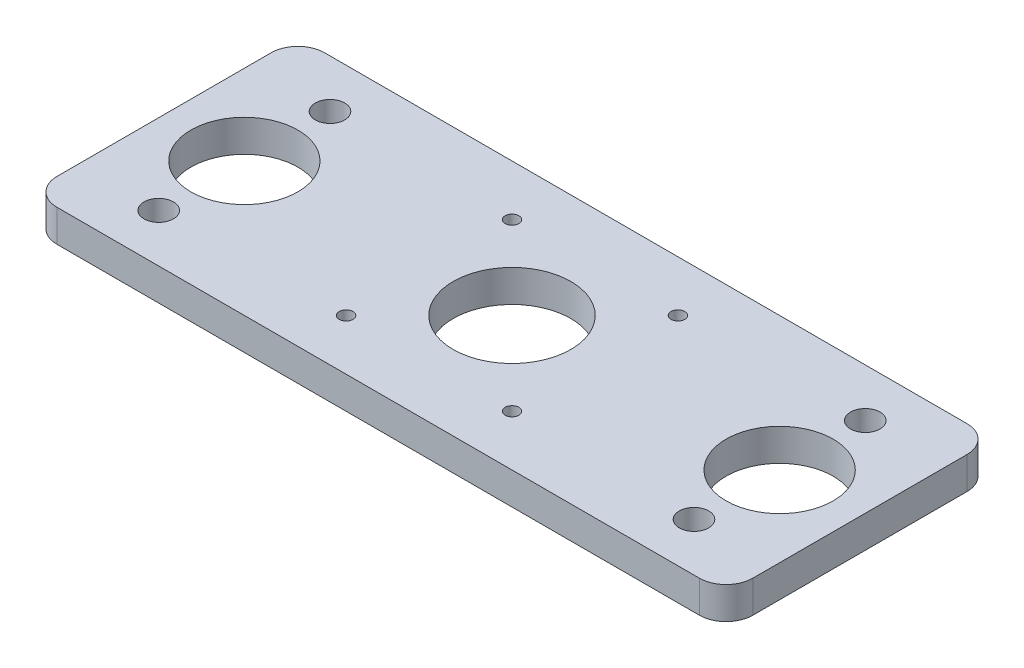
ISO-10303-21;
HEADER;
FILE_DESCRIPTION(('STEP AP214'),'2;1');
FILE_NAME('part.step','',(''),(''),'','','');
FILE_SCHEMA(('AUTOMOTIVE_DESIGN { 1 0 10303 214 1 1 1 1 }'));
ENDSEC;
DATA;
#1=APPLICATION_CONTEXT('core data for automotive mechanical design processes');
#2=APPLICATION_PROTOCOL_DEFINITION('international standard','automotive_design',2000,#1);
#3=PRODUCT_CONTEXT('',#1,'mechanical');
#4=PRODUCT('Part','Part','',(#3));
#5=PRODUCT_RELATED_PRODUCT_CATEGORY('part','',(#4));
#6=PRODUCT_DEFINITION_FORMATION('','',#4);
#7=PRODUCT_DEFINITION_CONTEXT('part definition',#1,'design');
#8=PRODUCT_DEFINITION('design','',#6,#7);
#9=PRODUCT_DEFINITION_SHAPE('','',#8);
#10=(LENGTH_UNIT() NAMED_UNIT(*) SI_UNIT(.MILLI.,.METRE.));
#11=(NAMED_UNIT(*) PLANE_ANGLE_UNIT() SI_UNIT($,.RADIAN.));
#12=(NAMED_UNIT(*) SI_UNIT($,.STERADIAN.) SOLID_ANGLE_UNIT());
#13=UNCERTAINTY_MEASURE_WITH_UNIT(LENGTH_MEASURE(1.E-05),#10,'distance_accuracy_value','');
#14=(GEOMETRIC_REPRESENTATION_CONTEXT(3) GLOBAL_UNCERTAINTY_ASSIGNED_CONTEXT((#13)) GLOBAL_UNIT_ASSIGNED_CONTEXT((#10,
#11,#12)) REPRESENTATION_CONTEXT('',''));
#15=CARTESIAN_POINT('',(0.,0.,0.));
#16=DIRECTION('',(0.,0.,1.));
#17=DIRECTION('',(1.,0.,0.));
#18=AXIS2_PLACEMENT_3D('',#15,#16,#17);
#19=CARTESIAN_POINT('',(-60.,6.,-20.));
#20=DIRECTION('',(0.,-1.,0.));
#21=DIRECTION('',(0.,0.,-1.));
#22=AXIS2_PLACEMENT_3D('',#19,#20,#21);
#23=CYLINDRICAL_SURFACE('',#22,5.);
#24=CARTESIAN_POINT('',(-60.,0.,-20.));
#25=DIRECTION('',(0.,1.,0.));
#26=DIRECTION('',(0.,0.,1.));
#27=AXIS2_PLACEMENT_3D('',#24,#25,#26);
#28=CIRCLE('',#27,5.);
#29=CARTESIAN_POINT('',(-65.,0.,-20.));
#30=VERTEX_POINT('',#29);
#31=CARTESIAN_POINT('',(-60.,0.,-25.));
#32=VERTEX_POINT('',#31);
#33=EDGE_CURVE('E166',#30,#32,#28,.F.);
#34=ORIENTED_EDGE('',*,*,#33,.F.);
#35=DIRECTION('',(0.,-1.,0.));
#36=VECTOR('',#35,1.);
#37=CARTESIAN_POINT('',(-65.,6.,-20.));
#38=LINE('',#37,#36);
#39=CARTESIAN_POINT('',(-65.,6.,-20.));
#40=VERTEX_POINT('',#39);
#41=EDGE_CURVE('E11',#40,#30,#38,.T.);
#42=ORIENTED_EDGE('',*,*,#41,.F.);
#43=CARTESIAN_POINT('',(-60.,6.,-20.));
#44=DIRECTION('',(0.,1.,0.));
#45=DIRECTION('',(0.,0.,1.));
#46=AXIS2_PLACEMENT_3D('',#43,#44,#45);
#47=CIRCLE('',#46,5.);
#48=CARTESIAN_POINT('',(-60.,6.,-25.));
#49=VERTEX_POINT('',#48);
#50=EDGE_CURVE('E219',#40,#49,#47,.F.);
#51=ORIENTED_EDGE('',*,*,#50,.T.);
#52=DIRECTION('',(0.,-1.,0.));
#53=VECTOR('',#52,1.);
#54=CARTESIAN_POINT('',(-60.,6.,-25.));
#55=LINE('',#54,#53);
#56=EDGE_CURVE('E53',#49,#32,#55,.T.);
#57=ORIENTED_EDGE('',*,*,#56,.T.);
#58=EDGE_LOOP('',(#34,#42,#51,#57));
#59=FACE_BOUND('',#58,.T.);
#60=ADVANCED_FACE('F37',(#59),#23,.T.);
#61=CARTESIAN_POINT('',(-65.,6.,0.));
#62=DIRECTION('',(-1.,0.,0.));
#63=DIRECTION('',(0.,0.,1.));
#64=AXIS2_PLACEMENT_3D('',#61,#62,#63);
#65=PLANE('',#64);
#66=DIRECTION('',(0.,0.,-1.));
#67=VECTOR('',#66,1.);
#68=CARTESIAN_POINT('',(-65.,0.,0.));
#69=LINE('',#68,#67);
#70=CARTESIAN_POINT('',(-65.,0.,20.));
#71=VERTEX_POINT('',#70);
#72=EDGE_CURVE('E168',#71,#30,#69,.T.);
#73=ORIENTED_EDGE('',*,*,#72,.F.);
#74=DIRECTION('',(0.,-1.,0.));
#75=VECTOR('',#74,1.);
#76=CARTESIAN_POINT('',(-65.,6.,20.));
#77=LINE('',#76,#75);
#78=CARTESIAN_POINT('',(-65.,6.,20.));
#79=VERTEX_POINT('',#78);
#80=EDGE_CURVE('E45',#79,#71,#77,.T.);
#81=ORIENTED_EDGE('',*,*,#80,.F.);
#82=DIRECTION('',(0.,0.,-1.));
#83=VECTOR('',#82,1.);
#84=CARTESIAN_POINT('',(-65.,6.,0.));
#85=LINE('',#84,#83);
#86=EDGE_CURVE('E245',#79,#40,#85,.T.);
#87=ORIENTED_EDGE('',*,*,#86,.T.);
#88=ORIENTED_EDGE('',*,*,#41,.T.);
#89=EDGE_LOOP('',(#73,#81,#87,#88));
#90=FACE_BOUND('',#89,.T.);
#91=ADVANCED_FACE('F236',(#90),#65,.T.);
#92=CARTESIAN_POINT('',(-60.,6.,20.));
#93=DIRECTION('',(0.,-1.,0.));
#94=DIRECTION('',(0.,0.,-1.));
#95=AXIS2_PLACEMENT_3D('',#92,#93,#94);
#96=CYLINDRICAL_SURFACE('',#95,5.);
#97=CARTESIAN_POINT('',(-60.,0.,20.));
#98=DIRECTION('',(0.,1.,0.));
#99=DIRECTION('',(0.,0.,1.));
#100=AXIS2_PLACEMENT_3D('',#97,#98,#99);
#101=CIRCLE('',#100,5.);
#102=CARTESIAN_POINT('',(-60.,0.,25.));
#103=VERTEX_POINT('',#102);
#104=EDGE_CURVE('E171',#103,#71,#101,.F.);
#105=ORIENTED_EDGE('',*,*,#104,.F.);
#106=DIRECTION('',(0.,-1.,0.));
#107=VECTOR('',#106,1.);
#108=CARTESIAN_POINT('',(-60.,6.,25.));
#109=LINE('',#108,#107);
#110=CARTESIAN_POINT('',(-60.,6.,25.));
#111=VERTEX_POINT('',#110);
#112=EDGE_CURVE('E225',#111,#103,#109,.T.);
#113=ORIENTED_EDGE('',*,*,#112,.F.);
#114=CARTESIAN_POINT('',(-60.,6.,20.));
#115=DIRECTION('',(0.,1.,0.));
#116=DIRECTION('',(0.,0.,1.));
#117=AXIS2_PLACEMENT_3D('',#114,#115,#116);
#118=CIRCLE('',#117,5.);
#119=EDGE_CURVE('E232',#111,#79,#118,.F.);
#120=ORIENTED_EDGE('',*,*,#119,.T.);
#121=ORIENTED_EDGE('',*,*,#80,.T.);
#122=EDGE_LOOP('',(#105,#113,#120,#121));
#123=FACE_BOUND('',#122,.T.);
#124=ADVANCED_FACE('F230',(#123),#96,.T.);
#125=CARTESIAN_POINT('',(0.,6.,25.));
#126=DIRECTION('',(0.,0.,1.));
#127=DIRECTION('',(1.,0.,0.));
#128=AXIS2_PLACEMENT_3D('',#125,#126,#127);
#129=PLANE('',#128);
#130=DIRECTION('',(-1.,0.,0.));
#131=VECTOR('',#130,1.);
#132=CARTESIAN_POINT('',(0.,0.,25.));
#133=LINE('',#132,#131);
#134=CARTESIAN_POINT('',(60.,0.,25.));
#135=VERTEX_POINT('',#134);
#136=EDGE_CURVE('E174',#135,#103,#133,.T.);
#137=ORIENTED_EDGE('',*,*,#136,.F.);
#138=DIRECTION('',(0.,-1.,0.));
#139=VECTOR('',#138,1.);
#140=CARTESIAN_POINT('',(60.,6.,25.));
#141=LINE('',#140,#139);
#142=CARTESIAN_POINT('',(60.,6.,25.));
#143=VERTEX_POINT('',#142);
#144=EDGE_CURVE('E223',#143,#135,#141,.T.);
#145=ORIENTED_EDGE('',*,*,#144,.F.);
#146=DIRECTION('',(-1.,0.,0.));
#147=VECTOR('',#146,1.);
#148=CARTESIAN_POINT('',(0.,6.,25.));
#149=LINE('',#148,#147);
#150=EDGE_CURVE('E128',#143,#111,#149,.T.);
#151=ORIENTED_EDGE('',*,*,#150,.T.);
#152=ORIENTED_EDGE('',*,*,#112,.T.);
#153=EDGE_LOOP('',(#137,#145,#151,#152));
#154=FACE_BOUND('',#153,.T.);
#155=ADVANCED_FACE('F243',(#154),#129,.T.);
#156=CARTESIAN_POINT('',(60.,6.,20.));
#157=DIRECTION('',(0.,-1.,0.));
#158=DIRECTION('',(0.,0.,-1.));
#159=AXIS2_PLACEMENT_3D('',#156,#157,#158);
#160=CYLINDRICAL_SURFACE('',#159,5.);
#161=CARTESIAN_POINT('',(60.,0.,20.));
#162=DIRECTION('',(0.,1.,0.));
#163=DIRECTION('',(0.,0.,1.));
#164=AXIS2_PLACEMENT_3D('',#161,#162,#163);
#165=CIRCLE('',#164,5.);
#166=CARTESIAN_POINT('',(65.,0.,20.));
#167=VERTEX_POINT('',#166);
#168=EDGE_CURVE('E177',#135,#167,#165,.T.);
#169=ORIENTED_EDGE('',*,*,#168,.T.);
#170=DIRECTION('',(0.,-1.,0.));
#171=VECTOR('',#170,1.);
#172=CARTESIAN_POINT('',(65.,6.,20.));
#173=LINE('',#172,#171);
#174=CARTESIAN_POINT('',(65.,6.,20.));
#175=VERTEX_POINT('',#174);
#176=EDGE_CURVE('E113',#175,#167,#173,.T.);
#177=ORIENTED_EDGE('',*,*,#176,.F.);
#178=CARTESIAN_POINT('',(60.,6.,20.));
#179=DIRECTION('',(0.,1.,0.));
#180=DIRECTION('',(0.,0.,1.));
#181=AXIS2_PLACEMENT_3D('',#178,#179,#180);
#182=CIRCLE('',#181,5.);
#183=EDGE_CURVE('E125',#143,#175,#182,.T.);
#184=ORIENTED_EDGE('',*,*,#183,.F.);
#185=ORIENTED_EDGE('',*,*,#144,.T.);
#186=EDGE_LOOP('',(#169,#177,#184,#185));
#187=FACE_BOUND('',#186,.T.);
#188=ADVANCED_FACE('F275',(#187),#160,.T.);
#189=CARTESIAN_POINT('',(65.,6.,0.));
#190=DIRECTION('',(1.,0.,0.));
#191=DIRECTION('',(0.,0.,-1.));
#192=AXIS2_PLACEMENT_3D('',#189,#190,#191);
#193=PLANE('',#192);
#194=DIRECTION('',(0.,0.,1.));
#195=VECTOR('',#194,1.);
#196=CARTESIAN_POINT('',(65.,0.,0.));
#197=LINE('',#196,#195);
#198=CARTESIAN_POINT('',(65.,0.,-20.));
#199=VERTEX_POINT('',#198);
#200=EDGE_CURVE('E110',#199,#167,#197,.T.);
#201=ORIENTED_EDGE('',*,*,#200,.F.);
#202=DIRECTION('',(0.,-1.,0.));
#203=VECTOR('',#202,1.);
#204=CARTESIAN_POINT('',(65.,6.,-20.));
#205=LINE('',#204,#203);
#206=CARTESIAN_POINT('',(65.,6.,-20.));
#207=VERTEX_POINT('',#206);
#208=EDGE_CURVE('E104',#207,#199,#205,.T.);
#209=ORIENTED_EDGE('',*,*,#208,.F.);
#210=DIRECTION('',(0.,0.,1.));
#211=VECTOR('',#210,1.);
#212=CARTESIAN_POINT('',(65.,6.,0.));
#213=LINE('',#212,#211);
#214=EDGE_CURVE('E108',#207,#175,#213,.T.);
#215=ORIENTED_EDGE('',*,*,#214,.T.);
#216=ORIENTED_EDGE('',*,*,#176,.T.);
#217=EDGE_LOOP('',(#201,#209,#215,#216));
#218=FACE_BOUND('',#217,.T.);
#219=ADVANCED_FACE('F106',(#218),#193,.T.);
#220=CARTESIAN_POINT('',(60.,6.,-20.));
#221=DIRECTION('',(0.,-1.,0.));
#222=DIRECTION('',(0.,0.,-1.));
#223=AXIS2_PLACEMENT_3D('',#220,#221,#222);
#224=CYLINDRICAL_SURFACE('',#223,5.);
#225=CARTESIAN_POINT('',(60.,0.,-20.));
#226=DIRECTION('',(0.,1.,0.));
#227=DIRECTION('',(0.,0.,1.));
#228=AXIS2_PLACEMENT_3D('',#225,#226,#227);
#229=CIRCLE('',#228,5.);
#230=CARTESIAN_POINT('',(60.,0.,-25.));
#231=VERTEX_POINT('',#230);
#232=EDGE_CURVE('E181',#199,#231,#229,.T.);
#233=ORIENTED_EDGE('',*,*,#232,.T.);
#234=DIRECTION('',(0.,-1.,0.));
#235=VECTOR('',#234,1.);
#236=CARTESIAN_POINT('',(60.,6.,-25.));
#237=LINE('',#236,#235);
#238=CARTESIAN_POINT('',(60.,6.,-25.));
#239=VERTEX_POINT('',#238);
#240=EDGE_CURVE('E79',#239,#231,#237,.T.);
#241=ORIENTED_EDGE('',*,*,#240,.F.);
#242=CARTESIAN_POINT('',(60.,6.,-20.));
#243=DIRECTION('',(0.,1.,0.));
#244=DIRECTION('',(0.,0.,1.));
#245=AXIS2_PLACEMENT_3D('',#242,#243,#244);
#246=CIRCLE('',#245,5.);
#247=EDGE_CURVE('E115',#207,#239,#246,.T.);
#248=ORIENTED_EDGE('',*,*,#247,.F.);
#249=ORIENTED_EDGE('',*,*,#208,.T.);
#250=EDGE_LOOP('',(#233,#241,#248,#249));
#251=FACE_BOUND('',#250,.T.);
#252=ADVANCED_FACE('F116',(#251),#224,.T.);
#253=CARTESIAN_POINT('',(-50.,6.,16.));
#254=DIRECTION('',(0.,-1.,0.));
#255=DIRECTION('',(0.,0.,-1.));
#256=AXIS2_PLACEMENT_3D('',#253,#254,#255);
#257=CYLINDRICAL_SURFACE('',#256,2.74999999999999);
#258=CARTESIAN_POINT('',(-50.,6.,16.));
#259=DIRECTION('',(0.,1.,0.));
#260=DIRECTION('',(0.,0.,1.));
#261=AXIS2_PLACEMENT_3D('',#258,#259,#260);
#262=CIRCLE('',#261,2.74999999999999);
#263=CARTESIAN_POINT('',(-50.,6.,18.75));
#264=VERTEX_POINT('',#263);
#265=EDGE_CURVE('E160',#264,#264,#262,.F.);
#266=ORIENTED_EDGE('',*,*,#265,.F.);
#267=EDGE_LOOP('',(#266));
#268=FACE_BOUND('',#267,.T.);
#269=CARTESIAN_POINT('',(-50.,0.,16.));
#270=DIRECTION('',(0.,1.,0.));
#271=DIRECTION('',(0.,0.,1.));
#272=AXIS2_PLACEMENT_3D('',#269,#270,#271);
#273=CIRCLE('',#272,2.74999999999999);
#274=CARTESIAN_POINT('',(-50.,0.,18.75));
#275=VERTEX_POINT('',#274);
#276=EDGE_CURVE('E213',#275,#275,#273,.F.);
#277=ORIENTED_EDGE('',*,*,#276,.T.);
#278=EDGE_LOOP('',(#277));
#279=FACE_BOUND('',#278,.T.);
#280=ADVANCED_FACE('F281',(#268,#279),#257,.F.);
#281=CARTESIAN_POINT('',(50.,6.,16.));
#282=DIRECTION('',(0.,-1.,0.));
#283=DIRECTION('',(0.,0.,-1.));
#284=AXIS2_PLACEMENT_3D('',#281,#282,#283);
#285=CYLINDRICAL_SURFACE('',#284,2.74999999999999);
#286=CARTESIAN_POINT('',(50.,6.,16.));
#287=DIRECTION('',(0.,1.,0.));
#288=DIRECTION('',(0.,0.,1.));
#289=AXIS2_PLACEMENT_3D('',#286,#287,#288);
#290=CIRCLE('',#289,2.74999999999999);
#291=CARTESIAN_POINT('',(50.,6.,18.75));
#292=VERTEX_POINT('',#291);
#293=EDGE_CURVE('E157',#292,#292,#290,.T.);
#294=ORIENTED_EDGE('',*,*,#293,.T.);
#295=EDGE_LOOP('',(#294));
#296=FACE_BOUND('',#295,.T.);
#297=CARTESIAN_POINT('',(50.,0.,16.));
#298=DIRECTION('',(0.,1.,0.));
#299=DIRECTION('',(0.,0.,1.));
#300=AXIS2_PLACEMENT_3D('',#297,#298,#299);
#301=CIRCLE('',#300,2.74999999999999);
#302=CARTESIAN_POINT('',(50.,0.,18.75));
#303=VERTEX_POINT('',#302);
#304=EDGE_CURVE('E210',#303,#303,#301,.T.);
#305=ORIENTED_EDGE('',*,*,#304,.F.);
#306=EDGE_LOOP('',(#305));
#307=FACE_BOUND('',#306,.T.);
#308=ADVANCED_FACE('F285',(#296,#307),#285,.F.);
#309=CARTESIAN_POINT('',(50.,6.,-16.));
#310=DIRECTION('',(0.,-1.,0.));
#311=DIRECTION('',(0.,0.,-1.));
#312=AXIS2_PLACEMENT_3D('',#309,#310,#311);
#313=CYLINDRICAL_SURFACE('',#312,2.75);
#314=CARTESIAN_POINT('',(50.,6.,-16.));
#315=DIRECTION('',(0.,1.,0.));
#316=DIRECTION('',(0.,0.,1.));
#317=AXIS2_PLACEMENT_3D('',#314,#315,#316);
#318=CIRCLE('',#317,2.75);
#319=CARTESIAN_POINT('',(50.,6.,-13.25));
#320=VERTEX_POINT('',#319);
#321=EDGE_CURVE('E154',#320,#320,#318,.T.);
#322=ORIENTED_EDGE('',*,*,#321,.T.);
#323=EDGE_LOOP('',(#322));
#324=FACE_BOUND('',#323,.T.);
#325=CARTESIAN_POINT('',(50.,0.,-16.));
#326=DIRECTION('',(0.,1.,0.));
#327=DIRECTION('',(0.,0.,1.));
#328=AXIS2_PLACEMENT_3D('',#325,#326,#327);
#329=CIRCLE('',#328,2.75);
#330=CARTESIAN_POINT('',(50.,0.,-13.25));
#331=VERTEX_POINT('',#330);
#332=EDGE_CURVE('E207',#331,#331,#329,.T.);
#333=ORIENTED_EDGE('',*,*,#332,.F.);
#334=EDGE_LOOP('',(#333));
#335=FACE_BOUND('',#334,.T.);
#336=ADVANCED_FACE('F291',(#324,#335),#313,.F.);
#337=CARTESIAN_POINT('',(50.,6.,0.));
#338=DIRECTION('',(0.,-1.,0.));
#339=DIRECTION('',(0.,0.,-1.));
#340=AXIS2_PLACEMENT_3D('',#337,#338,#339);
#341=CYLINDRICAL_SURFACE('',#340,10.);
#342=CARTESIAN_POINT('',(50.,6.,0.));
#343=DIRECTION('',(0.,1.,0.));
#344=DIRECTION('',(0.,0.,1.));
#345=AXIS2_PLACEMENT_3D('',#342,#343,#344);
#346=CIRCLE('',#345,10.);
#347=CARTESIAN_POINT('',(50.,6.,10.));
#348=VERTEX_POINT('',#347);
#349=EDGE_CURVE('E151',#348,#348,#346,.T.);
#350=ORIENTED_EDGE('',*,*,#349,.T.);
#351=EDGE_LOOP('',(#350));
#352=FACE_BOUND('',#351,.T.);
#353=CARTESIAN_POINT('',(50.,0.,0.));
#354=DIRECTION('',(0.,1.,0.));
#355=DIRECTION('',(0.,0.,1.));
#356=AXIS2_PLACEMENT_3D('',#353,#354,#355);
#357=CIRCLE('',#356,10.);
#358=CARTESIAN_POINT('',(50.,0.,10.));
#359=VERTEX_POINT('',#358);
#360=EDGE_CURVE('E204',#359,#359,#357,.T.);
#361=ORIENTED_EDGE('',*,*,#360,.F.);
#362=EDGE_LOOP('',(#361));
#363=FACE_BOUND('',#362,.T.);
#364=ADVANCED_FACE('F300',(#352,#363),#341,.F.);
#365=CARTESIAN_POINT('',(-15.4999999999996,6.,-15.4999999999983));
#366=DIRECTION('',(0.,-1.,0.));
#367=DIRECTION('',(0.,0.,-1.));
#368=AXIS2_PLACEMENT_3D('',#365,#366,#367);
#369=CYLINDRICAL_SURFACE('',#368,1.28355817354355);
#370=CARTESIAN_POINT('',(-15.4999999999996,6.,-15.4999999999983));
#371=DIRECTION('',(0.,1.,0.));
#372=DIRECTION('',(0.,0.,1.));
#373=AXIS2_PLACEMENT_3D('',#370,#371,#372);
#374=CIRCLE('',#373,1.28355817354355);
#375=CARTESIAN_POINT('',(-15.4999999999996,6.,-14.2164418264547));
#376=VERTEX_POINT('',#375);
#377=EDGE_CURVE('E148',#376,#376,#374,.T.);
#378=ORIENTED_EDGE('',*,*,#377,.T.);
#379=EDGE_LOOP('',(#378));
#380=FACE_BOUND('',#379,.T.);
#381=CARTESIAN_POINT('',(-15.4999999999996,0.,-15.4999999999983));
#382=DIRECTION('',(0.,1.,0.));
#383=DIRECTION('',(0.,0.,1.));
#384=AXIS2_PLACEMENT_3D('',#381,#382,#383);
#385=CIRCLE('',#384,1.28355817354355);
#386=CARTESIAN_POINT('',(-15.4999999999996,0.,-14.2164418264547));
#387=VERTEX_POINT('',#386);
#388=EDGE_CURVE('E201',#387,#387,#385,.T.);
#389=ORIENTED_EDGE('',*,*,#388,.F.);
#390=EDGE_LOOP('',(#389));
#391=FACE_BOUND('',#390,.T.);
#392=ADVANCED_FACE('F304',(#380,#391),#369,.F.);
#393=CARTESIAN_POINT('',(-15.4999999999978,6.,15.5000000000013));
#394=DIRECTION('',(0.,-1.,0.));
#395=DIRECTION('',(0.,0.,-1.));
#396=AXIS2_PLACEMENT_3D('',#393,#394,#395);
#397=CYLINDRICAL_SURFACE('',#396,1.28355817354343);
#398=CARTESIAN_POINT('',(-15.4999999999978,6.,15.5000000000013));
#399=DIRECTION('',(0.,1.,0.));
#400=DIRECTION('',(0.,0.,1.));
#401=AXIS2_PLACEMENT_3D('',#398,#399,#400);
#402=CIRCLE('',#401,1.28355817354343);
#403=CARTESIAN_POINT('',(-15.4999999999978,6.,16.7835581735447));
#404=VERTEX_POINT('',#403);
#405=EDGE_CURVE('E145',#404,#404,#402,.T.);
#406=ORIENTED_EDGE('',*,*,#405,.T.);
#407=EDGE_LOOP('',(#406));
#408=FACE_BOUND('',#407,.T.);
#409=CARTESIAN_POINT('',(-15.4999999999978,0.,15.5000000000013));
#410=DIRECTION('',(0.,1.,0.));
#411=DIRECTION('',(0.,0.,1.));
#412=AXIS2_PLACEMENT_3D('',#409,#410,#411);
#413=CIRCLE('',#412,1.28355817354343);
#414=CARTESIAN_POINT('',(-15.4999999999978,0.,16.7835581735447));
#415=VERTEX_POINT('',#414);
#416=EDGE_CURVE('E198',#415,#415,#413,.T.);
#417=ORIENTED_EDGE('',*,*,#416,.F.);
#418=EDGE_LOOP('',(#417));
#419=FACE_BOUND('',#418,.T.);
#420=ADVANCED_FACE('F308',(#408,#419),#397,.F.);
#421=CARTESIAN_POINT('',(15.5000000000017,6.,15.4999999999996));
#422=DIRECTION('',(0.,-1.,0.));
#423=DIRECTION('',(0.,0.,-1.));
#424=AXIS2_PLACEMENT_3D('',#421,#422,#423);
#425=CYLINDRICAL_SURFACE('',#424,1.28355817354161);
#426=CARTESIAN_POINT('',(15.5000000000017,6.,15.4999999999996));
#427=DIRECTION('',(0.,1.,0.));
#428=DIRECTION('',(0.,0.,1.));
#429=AXIS2_PLACEMENT_3D('',#426,#427,#428);
#430=CIRCLE('',#429,1.28355817354161);
#431=CARTESIAN_POINT('',(15.5000000000017,6.,16.7835581735412));
#432=VERTEX_POINT('',#431);
#433=EDGE_CURVE('E142',#432,#432,#430,.T.);
#434=ORIENTED_EDGE('',*,*,#433,.T.);
#435=EDGE_LOOP('',(#434));
#436=FACE_BOUND('',#435,.T.);
#437=CARTESIAN_POINT('',(15.5000000000017,0.,15.4999999999996));
#438=DIRECTION('',(0.,1.,0.));
#439=DIRECTION('',(0.,0.,1.));
#440=AXIS2_PLACEMENT_3D('',#437,#438,#439);
#441=CIRCLE('',#440,1.28355817354161);
#442=CARTESIAN_POINT('',(15.5000000000017,0.,16.7835581735412));
#443=VERTEX_POINT('',#442);
#444=EDGE_CURVE('E195',#443,#443,#441,.T.);
#445=ORIENTED_EDGE('',*,*,#444,.F.);
#446=EDGE_LOOP('',(#445));
#447=FACE_BOUND('',#446,.T.);
#448=ADVANCED_FACE('F312',(#436,#447),#425,.F.);
#449=CARTESIAN_POINT('',(15.5,6.,-15.5));
#450=DIRECTION('',(0.,-1.,0.));
#451=DIRECTION('',(0.,0.,-1.));
#452=AXIS2_PLACEMENT_3D('',#449,#450,#451);
#453=CYLINDRICAL_SURFACE('',#452,1.28355817354166);
#454=CARTESIAN_POINT('',(15.5,6.,-15.5));
#455=DIRECTION('',(0.,1.,0.));
#456=DIRECTION('',(0.,0.,1.));
#457=AXIS2_PLACEMENT_3D('',#454,#455,#456);
#458=CIRCLE('',#457,1.28355817354166);
#459=CARTESIAN_POINT('',(15.5,6.,-14.2164418264583));
#460=VERTEX_POINT('',#459);
#461=EDGE_CURVE('E139',#460,#460,#458,.T.);
#462=ORIENTED_EDGE('',*,*,#461,.T.);
#463=EDGE_LOOP('',(#462));
#464=FACE_BOUND('',#463,.T.);
#465=CARTESIAN_POINT('',(15.5,0.,-15.5));
#466=DIRECTION('',(0.,1.,0.));
#467=DIRECTION('',(0.,0.,1.));
#468=AXIS2_PLACEMENT_3D('',#465,#466,#467);
#469=CIRCLE('',#468,1.28355817354166);
#470=CARTESIAN_POINT('',(15.5,0.,-14.2164418264583));
#471=VERTEX_POINT('',#470);
#472=EDGE_CURVE('E192',#471,#471,#469,.T.);
#473=ORIENTED_EDGE('',*,*,#472,.F.);
#474=EDGE_LOOP('',(#473));
#475=FACE_BOUND('',#474,.T.);
#476=ADVANCED_FACE('F316',(#464,#475),#453,.F.);
#477=CARTESIAN_POINT('',(0.,6.,0.));
#478=DIRECTION('',(0.,-1.,0.));
#479=DIRECTION('',(0.,0.,-1.));
#480=AXIS2_PLACEMENT_3D('',#477,#478,#479);
#481=CYLINDRICAL_SURFACE('',#480,11.);
#482=CARTESIAN_POINT('',(0.,6.,0.));
#483=DIRECTION('',(0.,1.,0.));
#484=DIRECTION('',(0.,0.,1.));
#485=AXIS2_PLACEMENT_3D('',#482,#483,#484);
#486=CIRCLE('',#485,11.);
#487=CARTESIAN_POINT('',(0.,6.,11.));
#488=VERTEX_POINT('',#487);
#489=EDGE_CURVE('E136',#488,#488,#486,.T.);
#490=ORIENTED_EDGE('',*,*,#489,.T.);
#491=EDGE_LOOP('',(#490));
#492=FACE_BOUND('',#491,.T.);
#493=CARTESIAN_POINT('',(0.,0.,0.));
#494=DIRECTION('',(0.,1.,0.));
#495=DIRECTION('',(0.,0.,1.));
#496=AXIS2_PLACEMENT_3D('',#493,#494,#495);
#497=CIRCLE('',#496,11.);
#498=CARTESIAN_POINT('',(0.,0.,11.));
#499=VERTEX_POINT('',#498);
#500=EDGE_CURVE('E189',#499,#499,#497,.T.);
#501=ORIENTED_EDGE('',*,*,#500,.F.);
#502=EDGE_LOOP('',(#501));
#503=FACE_BOUND('',#502,.T.);
#504=ADVANCED_FACE('F260',(#492,#503),#481,.F.);
#505=CARTESIAN_POINT('',(-50.,6.,-16.));
#506=DIRECTION('',(0.,-1.,0.));
#507=DIRECTION('',(0.,0.,-1.));
#508=AXIS2_PLACEMENT_3D('',#505,#506,#507);
#509=CYLINDRICAL_SURFACE('',#508,2.75);
#510=CARTESIAN_POINT('',(-50.,6.,-16.));
#511=DIRECTION('',(0.,1.,0.));
#512=DIRECTION('',(0.,0.,1.));
#513=AXIS2_PLACEMENT_3D('',#510,#511,#512);
#514=CIRCLE('',#513,2.75);
#515=CARTESIAN_POINT('',(-50.,6.,-13.25));
#516=VERTEX_POINT('',#515);
#517=EDGE_CURVE('E133',#516,#516,#514,.F.);
#518=ORIENTED_EDGE('',*,*,#517,.F.);
#519=EDGE_LOOP('',(#518));
#520=FACE_BOUND('',#519,.T.);
#521=CARTESIAN_POINT('',(-50.,0.,-16.));
#522=DIRECTION('',(0.,1.,0.));
#523=DIRECTION('',(0.,0.,1.));
#524=AXIS2_PLACEMENT_3D('',#521,#522,#523);
#525=CIRCLE('',#524,2.75);
#526=CARTESIAN_POINT('',(-50.,0.,-13.25));
#527=VERTEX_POINT('',#526);
#528=EDGE_CURVE('E186',#527,#527,#525,.F.);
#529=ORIENTED_EDGE('',*,*,#528,.T.);
#530=EDGE_LOOP('',(#529));
#531=FACE_BOUND('',#530,.T.);
#532=ADVANCED_FACE('F252',(#520,#531),#509,.F.);
#533=CARTESIAN_POINT('',(0.,6.,-25.));
#534=DIRECTION('',(0.,0.,-1.));
#535=DIRECTION('',(-1.,0.,0.));
#536=AXIS2_PLACEMENT_3D('',#533,#534,#535);
#537=PLANE('',#536);
#538=DIRECTION('',(1.,0.,0.));
#539=VECTOR('',#538,1.);
#540=CARTESIAN_POINT('',(0.,0.,-25.));
#541=LINE('',#540,#539);
#542=EDGE_CURVE('E183',#32,#231,#541,.T.);
#543=ORIENTED_EDGE('',*,*,#542,.F.);
#544=ORIENTED_EDGE('',*,*,#56,.F.);
#545=DIRECTION('',(1.,0.,0.));
#546=VECTOR('',#545,1.);
#547=CARTESIAN_POINT('',(0.,6.,-25.));
#548=LINE('',#547,#546);
#549=EDGE_CURVE('E119',#49,#239,#548,.T.);
#550=ORIENTED_EDGE('',*,*,#549,.T.);
#551=ORIENTED_EDGE('',*,*,#240,.T.);
#552=EDGE_LOOP('',(#543,#544,#550,#551));
#553=FACE_BOUND('',#552,.T.);
#554=ADVANCED_FACE('F249',(#553),#537,.T.);
#555=CARTESIAN_POINT('',(-50.,6.,0.));
#556=DIRECTION('',(0.,-1.,0.));
#557=DIRECTION('',(0.,0.,-1.));
#558=AXIS2_PLACEMENT_3D('',#555,#556,#557);
#559=CYLINDRICAL_SURFACE('',#558,10.);
#560=CARTESIAN_POINT('',(-50.,6.,0.));
#561=DIRECTION('',(0.,1.,0.));
#562=DIRECTION('',(0.,0.,1.));
#563=AXIS2_PLACEMENT_3D('',#560,#561,#562);
#564=CIRCLE('',#563,10.);
#565=CARTESIAN_POINT('',(-50.,6.,10.));
#566=VERTEX_POINT('',#565);
#567=EDGE_CURVE('E163',#566,#566,#564,.F.);
#568=ORIENTED_EDGE('',*,*,#567,.F.);
#569=EDGE_LOOP('',(#568));
#570=FACE_BOUND('',#569,.T.);
#571=CARTESIAN_POINT('',(-50.,0.,0.));
#572=DIRECTION('',(0.,1.,0.));
#573=DIRECTION('',(0.,0.,1.));
#574=AXIS2_PLACEMENT_3D('',#571,#572,#573);
#575=CIRCLE('',#574,10.);
#576=CARTESIAN_POINT('',(-50.,0.,10.));
#577=VERTEX_POINT('',#576);
#578=EDGE_CURVE('E216',#577,#577,#575,.F.);
#579=ORIENTED_EDGE('',*,*,#578,.T.);
#580=EDGE_LOOP('',(#579));
#581=FACE_BOUND('',#580,.T.);
#582=ADVANCED_FACE('F251',(#570,#581),#559,.F.);
#583=CARTESIAN_POINT('',(0.,6.,0.));
#584=DIRECTION('',(0.,1.,0.));
#585=DIRECTION('',(0.,0.,1.));
#586=AXIS2_PLACEMENT_3D('',#583,#584,#585);
#587=PLANE('',#586);
#588=ORIENTED_EDGE('',*,*,#50,.F.);
#589=ORIENTED_EDGE('',*,*,#86,.F.);
#590=ORIENTED_EDGE('',*,*,#119,.F.);
#591=ORIENTED_EDGE('',*,*,#150,.F.);
#592=ORIENTED_EDGE('',*,*,#183,.T.);
#593=ORIENTED_EDGE('',*,*,#214,.F.);
#594=ORIENTED_EDGE('',*,*,#247,.T.);
#595=ORIENTED_EDGE('',*,*,#549,.F.);
#596=EDGE_LOOP('',(#588,#589,#590,#591,#592,#593,#594,#595));
#597=FACE_BOUND('',#596,.T.);
#598=ORIENTED_EDGE('',*,*,#517,.T.);
#599=EDGE_LOOP('',(#598));
#600=FACE_BOUND('',#599,.T.);
#601=ORIENTED_EDGE('',*,*,#489,.F.);
#602=EDGE_LOOP('',(#601));
#603=FACE_BOUND('',#602,.T.);
#604=ORIENTED_EDGE('',*,*,#461,.F.);
#605=EDGE_LOOP('',(#604));
#606=FACE_BOUND('',#605,.T.);
#607=ORIENTED_EDGE('',*,*,#433,.F.);
#608=EDGE_LOOP('',(#607));
#609=FACE_BOUND('',#608,.T.);
#610=ORIENTED_EDGE('',*,*,#405,.F.);
#611=EDGE_LOOP('',(#610));
#612=FACE_BOUND('',#611,.T.);
#613=ORIENTED_EDGE('',*,*,#377,.F.);
#614=EDGE_LOOP('',(#613));
#615=FACE_BOUND('',#614,.T.);
#616=ORIENTED_EDGE('',*,*,#349,.F.);
#617=EDGE_LOOP('',(#616));
#618=FACE_BOUND('',#617,.T.);
#619=ORIENTED_EDGE('',*,*,#321,.F.);
#620=EDGE_LOOP('',(#619));
#621=FACE_BOUND('',#620,.T.);
#622=ORIENTED_EDGE('',*,*,#293,.F.);
#623=EDGE_LOOP('',(#622));
#624=FACE_BOUND('',#623,.T.);
#625=ORIENTED_EDGE('',*,*,#265,.T.);
#626=EDGE_LOOP('',(#625));
#627=FACE_BOUND('',#626,.T.);
#628=ORIENTED_EDGE('',*,*,#567,.T.);
#629=EDGE_LOOP('',(#628));
#630=FACE_BOUND('',#629,.T.);
#631=ADVANCED_FACE('F121',(#597,#600,#603,#606,#609,#612,#615,#618,#621,#624,#627,#630),#587,.T.);
#632=CARTESIAN_POINT('',(0.,0.,0.));
#633=DIRECTION('',(0.,1.,0.));
#634=DIRECTION('',(0.,0.,1.));
#635=AXIS2_PLACEMENT_3D('',#632,#633,#634);
#636=PLANE('',#635);
#637=ORIENTED_EDGE('',*,*,#33,.T.);
#638=ORIENTED_EDGE('',*,*,#542,.T.);
#639=ORIENTED_EDGE('',*,*,#232,.F.);
#640=ORIENTED_EDGE('',*,*,#200,.T.);
#641=ORIENTED_EDGE('',*,*,#168,.F.);
#642=ORIENTED_EDGE('',*,*,#136,.T.);
#643=ORIENTED_EDGE('',*,*,#104,.T.);
#644=ORIENTED_EDGE('',*,*,#72,.T.);
#645=EDGE_LOOP('',(#637,#638,#639,#640,#641,#642,#643,#644));
#646=FACE_BOUND('',#645,.T.);
#647=ORIENTED_EDGE('',*,*,#528,.F.);
#648=EDGE_LOOP('',(#647));
#649=FACE_BOUND('',#648,.T.);
#650=ORIENTED_EDGE('',*,*,#500,.T.);
#651=EDGE_LOOP('',(#650));
#652=FACE_BOUND('',#651,.T.);
#653=ORIENTED_EDGE('',*,*,#472,.T.);
#654=EDGE_LOOP('',(#653));
#655=FACE_BOUND('',#654,.T.);
#656=ORIENTED_EDGE('',*,*,#444,.T.);
#657=EDGE_LOOP('',(#656));
#658=FACE_BOUND('',#657,.T.);
#659=ORIENTED_EDGE('',*,*,#416,.T.);
#660=EDGE_LOOP('',(#659));
#661=FACE_BOUND('',#660,.T.);
#662=ORIENTED_EDGE('',*,*,#388,.T.);
#663=EDGE_LOOP('',(#662));
#664=FACE_BOUND('',#663,.T.);
#665=ORIENTED_EDGE('',*,*,#360,.T.);
#666=EDGE_LOOP('',(#665));
#667=FACE_BOUND('',#666,.T.);
#668=ORIENTED_EDGE('',*,*,#332,.T.);
#669=EDGE_LOOP('',(#668));
#670=FACE_BOUND('',#669,.T.);
#671=ORIENTED_EDGE('',*,*,#304,.T.);
#672=EDGE_LOOP('',(#671));
#673=FACE_BOUND('',#672,.T.);
#674=ORIENTED_EDGE('',*,*,#276,.F.);
#675=EDGE_LOOP('',(#674));
#676=FACE_BOUND('',#675,.T.);
#677=ORIENTED_EDGE('',*,*,#578,.F.);
#678=EDGE_LOOP('',(#677));
#679=FACE_BOUND('',#678,.T.);
#680=ADVANCED_FACE('F238',(#646,#649,#652,#655,#658,#661,#664,#667,#670,#673,#676,#679),#636,.F.);
#681=CLOSED_SHELL('',(#60,#91,#124,#155,#188,#219,#252,#280,#308,#336,#364,#392,#420,#448,#476,
#504,#532,#554,#582,#631,#680));
#682=MANIFOLD_SOLID_BREP('B2',#681);
#683=ADVANCED_BREP_SHAPE_REPRESENTATION('',(#18,#682),#14);
#684=SHAPE_DEFINITION_REPRESENTATION(#9,#683);
ENDSEC;
END-ISO-10303-21;
